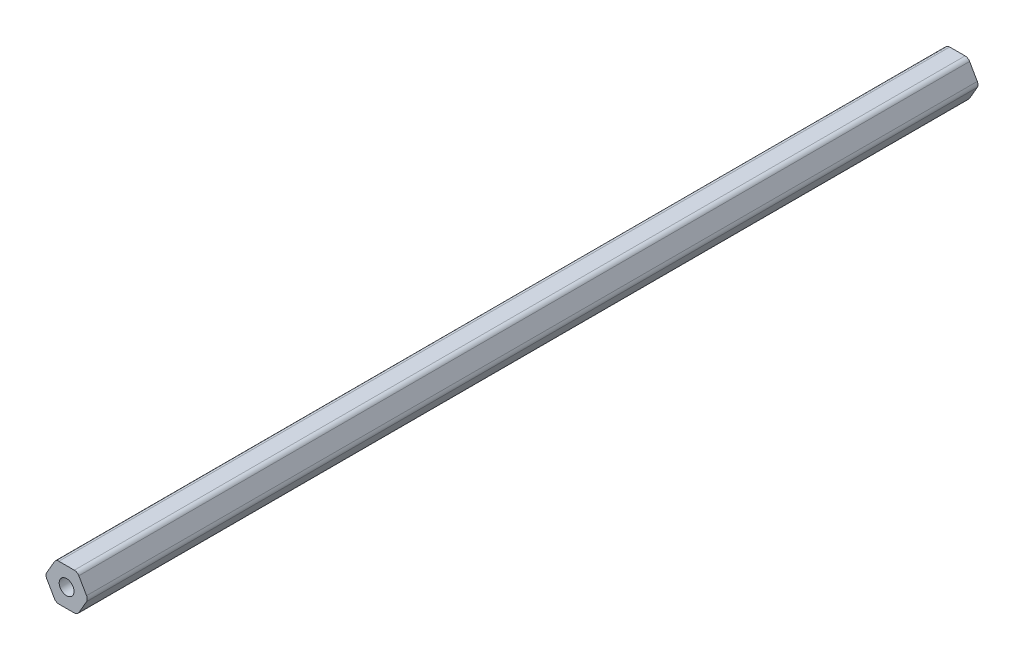
ISO-10303-21;
HEADER;
FILE_DESCRIPTION(('STEP AP214'),'2;1');
FILE_NAME('part.step','',(''),(''),'','','');
FILE_SCHEMA(('AUTOMOTIVE_DESIGN { 1 0 10303 214 1 1 1 1 }'));
ENDSEC;
DATA;
#1=APPLICATION_CONTEXT('core data for automotive mechanical design processes');
#2=APPLICATION_PROTOCOL_DEFINITION('international standard','automotive_design',2000,#1);
#3=PRODUCT_CONTEXT('',#1,'mechanical');
#4=PRODUCT('Part','Part','',(#3));
#5=PRODUCT_RELATED_PRODUCT_CATEGORY('part','',(#4));
#6=PRODUCT_DEFINITION_FORMATION('','',#4);
#7=PRODUCT_DEFINITION_CONTEXT('part definition',#1,'design');
#8=PRODUCT_DEFINITION('design','',#6,#7);
#9=PRODUCT_DEFINITION_SHAPE('','',#8);
#10=(LENGTH_UNIT() NAMED_UNIT(*) SI_UNIT(.MILLI.,.METRE.));
#11=(NAMED_UNIT(*) PLANE_ANGLE_UNIT() SI_UNIT($,.RADIAN.));
#12=(NAMED_UNIT(*) SI_UNIT($,.STERADIAN.) SOLID_ANGLE_UNIT());
#13=UNCERTAINTY_MEASURE_WITH_UNIT(LENGTH_MEASURE(1.E-05),#10,'distance_accuracy_value','');
#14=(GEOMETRIC_REPRESENTATION_CONTEXT(3) GLOBAL_UNCERTAINTY_ASSIGNED_CONTEXT((#13)) GLOBAL_UNIT_ASSIGNED_CONTEXT((#10,
#11,#12)) REPRESENTATION_CONTEXT('',''));
#15=CARTESIAN_POINT('',(0.,0.,0.));
#16=DIRECTION('',(0.,0.,1.));
#17=DIRECTION('',(1.,0.,0.));
#18=AXIS2_PLACEMENT_3D('',#15,#16,#17);
#19=CARTESIAN_POINT('',(0.,0.,304.8));
#20=DIRECTION('',(0.,0.,1.));
#21=DIRECTION('',(1.,0.,0.));
#22=AXIS2_PLACEMENT_3D('',#19,#20,#21);
#23=PLANE('',#22);
#24=DIRECTION('',(-0.499999999999995,-0.866025403784442,0.));
#25=VECTOR('',#24,1.);
#26=CARTESIAN_POINT('',(-4.29020386201017,9.04112787707909,304.8));
#27=LINE('',#26,#25);
#28=CARTESIAN_POINT('',(-4.80346825131974,8.15212787707908,304.8));
#29=VERTEX_POINT('',#28);
#30=CARTESIAN_POINT('',(-7.44311368205469,3.58012787707905,304.8));
#31=VERTEX_POINT('',#30);
#32=EDGE_CURVE('E273',#29,#31,#27,.T.);
#33=ORIENTED_EDGE('',*,*,#32,.T.);
#34=CARTESIAN_POINT('',(-5.90332051412595,2.69112787707906,304.8));
#35=DIRECTION('',(0.,0.,1.));
#36=DIRECTION('',(1.,0.,0.));
#37=AXIS2_PLACEMENT_3D('',#34,#35,#36);
#38=CIRCLE('',#37,1.778);
#39=CARTESIAN_POINT('',(-7.44311368205468,1.80212787707905,304.8));
#40=VERTEX_POINT('',#39);
#41=EDGE_CURVE('E210',#31,#40,#38,.T.);
#42=ORIENTED_EDGE('',*,*,#41,.T.);
#43=DIRECTION('',(0.500000000000007,-0.866025403784434,0.));
#44=VECTOR('',#43,1.);
#45=CARTESIAN_POINT('',(-7.95637807136426,2.69112787707905,304.8));
#46=LINE('',#45,#44);
#47=CARTESIAN_POINT('',(-4.80346825131967,-2.76987212292094,304.8));
#48=VERTEX_POINT('',#47);
#49=EDGE_CURVE('E155',#40,#48,#46,.T.);
#50=ORIENTED_EDGE('',*,*,#49,.T.);
#51=CARTESIAN_POINT('',(-3.26367508339094,-1.88087212292093,304.8));
#52=DIRECTION('',(0.,0.,1.));
#53=DIRECTION('',(1.,0.,0.));
#54=AXIS2_PLACEMENT_3D('',#51,#52,#53);
#55=CIRCLE('',#54,1.778);
#56=CARTESIAN_POINT('',(-3.26367508339092,-3.65887212292093,304.8));
#57=VERTEX_POINT('',#56);
#58=EDGE_CURVE('E66',#48,#57,#55,.T.);
#59=ORIENTED_EDGE('',*,*,#58,.T.);
#60=DIRECTION('',(1.,0.,0.));
#61=VECTOR('',#60,1.);
#62=CARTESIAN_POINT('',(-4.29020386201008,-3.65887212292094,304.8));
#63=LINE('',#62,#61);
#64=CARTESIAN_POINT('',(2.01561577807904,-3.65887212292087,304.8));
#65=VERTEX_POINT('',#64);
#66=EDGE_CURVE('E177',#57,#65,#63,.T.);
#67=ORIENTED_EDGE('',*,*,#66,.T.);
#68=CARTESIAN_POINT('',(2.01561577807902,-1.88087212292087,304.8));
#69=DIRECTION('',(0.,0.,1.));
#70=DIRECTION('',(1.,0.,0.));
#71=AXIS2_PLACEMENT_3D('',#68,#69,#70);
#72=CIRCLE('',#71,1.778);
#73=CARTESIAN_POINT('',(3.55540894600776,-2.76987212292086,304.8));
#74=VERTEX_POINT('',#73);
#75=EDGE_CURVE('E202',#65,#74,#72,.T.);
#76=ORIENTED_EDGE('',*,*,#75,.T.);
#77=DIRECTION('',(0.499999999999995,0.866025403784441,0.));
#78=VECTOR('',#77,1.);
#79=CARTESIAN_POINT('',(3.04214455669819,-3.65887212292086,304.8));
#80=LINE('',#79,#78);
#81=CARTESIAN_POINT('',(6.19505437674267,1.8021278770791,304.8));
#82=VERTEX_POINT('',#81);
#83=EDGE_CURVE('E170',#74,#82,#80,.T.);
#84=ORIENTED_EDGE('',*,*,#83,.T.);
#85=CARTESIAN_POINT('',(4.65526120881393,2.69112787707909,304.8));
#86=DIRECTION('',(0.,0.,1.));
#87=DIRECTION('',(1.,0.,0.));
#88=AXIS2_PLACEMENT_3D('',#85,#86,#87);
#89=CIRCLE('',#88,1.778);
#90=CARTESIAN_POINT('',(6.19505437674266,3.58012787707909,304.8));
#91=VERTEX_POINT('',#90);
#92=EDGE_CURVE('E199',#82,#91,#89,.T.);
#93=ORIENTED_EDGE('',*,*,#92,.T.);
#94=DIRECTION('',(-0.500000000000001,0.866025403784438,0.));
#95=VECTOR('',#94,1.);
#96=CARTESIAN_POINT('',(6.70831876605224,2.6911278770791,304.8));
#97=LINE('',#96,#95);
#98=CARTESIAN_POINT('',(3.55540894600768,8.15212787707911,304.8));
#99=VERTEX_POINT('',#98);
#100=EDGE_CURVE('E239',#91,#99,#97,.T.);
#101=ORIENTED_EDGE('',*,*,#100,.T.);
#102=CARTESIAN_POINT('',(2.01561577807895,7.26312787707911,304.8));
#103=DIRECTION('',(0.,0.,1.));
#104=DIRECTION('',(1.,0.,0.));
#105=AXIS2_PLACEMENT_3D('',#102,#103,#104);
#106=CIRCLE('',#105,1.778);
#107=CARTESIAN_POINT('',(2.01561577807894,9.04112787707911,304.8));
#108=VERTEX_POINT('',#107);
#109=EDGE_CURVE('E196',#99,#108,#106,.T.);
#110=ORIENTED_EDGE('',*,*,#109,.T.);
#111=DIRECTION('',(-1.,0.,0.));
#112=VECTOR('',#111,1.);
#113=CARTESIAN_POINT('',(3.0421445566981,9.04112787707911,304.8));
#114=LINE('',#113,#112);
#115=CARTESIAN_POINT('',(-3.26367508339101,9.04112787707909,304.8));
#116=VERTEX_POINT('',#115);
#117=EDGE_CURVE('E252',#108,#116,#114,.T.);
#118=ORIENTED_EDGE('',*,*,#117,.T.);
#119=CARTESIAN_POINT('',(-3.263675083391,7.26312787707909,304.8));
#120=DIRECTION('',(0.,0.,1.));
#121=DIRECTION('',(1.,0.,0.));
#122=AXIS2_PLACEMENT_3D('',#119,#120,#121);
#123=CIRCLE('',#122,1.778);
#124=EDGE_CURVE('E207',#116,#29,#123,.T.);
#125=ORIENTED_EDGE('',*,*,#124,.T.);
#126=EDGE_LOOP('',(#33,#42,#50,#59,#67,#76,#84,#93,#101,#110,#118,#125));
#127=FACE_BOUND('',#126,.T.);
#128=CARTESIAN_POINT('',(-0.624029652656013,2.6911278770791,304.8));
#129=DIRECTION('',(0.,0.,1.));
#130=DIRECTION('',(1.,0.,0.));
#131=AXIS2_PLACEMENT_3D('',#128,#129,#130);
#132=CIRCLE('',#131,2.54);
#133=CARTESIAN_POINT('',(-3.16402965265601,2.6911278770791,304.8));
#134=VERTEX_POINT('',#133);
#135=EDGE_CURVE('E268',#134,#134,#132,.T.);
#136=ORIENTED_EDGE('',*,*,#135,.F.);
#137=EDGE_LOOP('',(#136));
#138=FACE_BOUND('',#137,.T.);
#139=ADVANCED_FACE('F43',(#127,#138),#23,.T.);
#140=CARTESIAN_POINT('',(0.,0.,0.));
#141=DIRECTION('',(0.,0.,1.));
#142=DIRECTION('',(1.,0.,0.));
#143=AXIS2_PLACEMENT_3D('',#140,#141,#142);
#144=PLANE('',#143);
#145=DIRECTION('',(0.500000000000007,-0.866025403784434,0.));
#146=VECTOR('',#145,1.);
#147=CARTESIAN_POINT('',(-7.95637807136426,2.69112787707905,0.));
#148=LINE('',#147,#146);
#149=CARTESIAN_POINT('',(-7.44311368205468,1.80212787707905,0.));
#150=VERTEX_POINT('',#149);
#151=CARTESIAN_POINT('',(-4.80346825131967,-2.76987212292094,0.));
#152=VERTEX_POINT('',#151);
#153=EDGE_CURVE('E153',#150,#152,#148,.T.);
#154=ORIENTED_EDGE('',*,*,#153,.F.);
#155=CARTESIAN_POINT('',(-5.90332051412595,2.69112787707906,0.));
#156=DIRECTION('',(0.,0.,1.));
#157=DIRECTION('',(1.,0.,0.));
#158=AXIS2_PLACEMENT_3D('',#155,#156,#157);
#159=CIRCLE('',#158,1.778);
#160=CARTESIAN_POINT('',(-7.44311368205469,3.58012787707905,0.));
#161=VERTEX_POINT('',#160);
#162=EDGE_CURVE('E135',#150,#161,#159,.F.);
#163=ORIENTED_EDGE('',*,*,#162,.T.);
#164=DIRECTION('',(-0.499999999999995,-0.866025403784442,0.));
#165=VECTOR('',#164,1.);
#166=CARTESIAN_POINT('',(-4.29020386201017,9.04112787707909,0.));
#167=LINE('',#166,#165);
#168=CARTESIAN_POINT('',(-4.80346825131974,8.15212787707908,0.));
#169=VERTEX_POINT('',#168);
#170=EDGE_CURVE('E166',#169,#161,#167,.T.);
#171=ORIENTED_EDGE('',*,*,#170,.F.);
#172=CARTESIAN_POINT('',(-3.263675083391,7.26312787707909,0.));
#173=DIRECTION('',(0.,0.,1.));
#174=DIRECTION('',(1.,0.,0.));
#175=AXIS2_PLACEMENT_3D('',#172,#173,#174);
#176=CIRCLE('',#175,1.778);
#177=CARTESIAN_POINT('',(-3.26367508339101,9.04112787707909,0.));
#178=VERTEX_POINT('',#177);
#179=EDGE_CURVE('E147',#169,#178,#176,.F.);
#180=ORIENTED_EDGE('',*,*,#179,.T.);
#181=DIRECTION('',(-1.,0.,0.));
#182=VECTOR('',#181,1.);
#183=CARTESIAN_POINT('',(3.0421445566981,9.04112787707911,0.));
#184=LINE('',#183,#182);
#185=CARTESIAN_POINT('',(2.01561577807894,9.04112787707911,0.));
#186=VERTEX_POINT('',#185);
#187=EDGE_CURVE('E172',#186,#178,#184,.T.);
#188=ORIENTED_EDGE('',*,*,#187,.F.);
#189=CARTESIAN_POINT('',(2.01561577807895,7.26312787707911,0.));
#190=DIRECTION('',(0.,0.,1.));
#191=DIRECTION('',(1.,0.,0.));
#192=AXIS2_PLACEMENT_3D('',#189,#190,#191);
#193=CIRCLE('',#192,1.778);
#194=CARTESIAN_POINT('',(3.55540894600768,8.15212787707911,0.));
#195=VERTEX_POINT('',#194);
#196=EDGE_CURVE('E157',#186,#195,#193,.F.);
#197=ORIENTED_EDGE('',*,*,#196,.T.);
#198=DIRECTION('',(-0.500000000000001,0.866025403784438,0.));
#199=VECTOR('',#198,1.);
#200=CARTESIAN_POINT('',(6.70831876605224,2.6911278770791,0.));
#201=LINE('',#200,#199);
#202=CARTESIAN_POINT('',(6.19505437674266,3.58012787707909,0.));
#203=VERTEX_POINT('',#202);
#204=EDGE_CURVE('E242',#203,#195,#201,.T.);
#205=ORIENTED_EDGE('',*,*,#204,.F.);
#206=CARTESIAN_POINT('',(4.65526120881393,2.69112787707909,0.));
#207=DIRECTION('',(0.,0.,1.));
#208=DIRECTION('',(1.,0.,0.));
#209=AXIS2_PLACEMENT_3D('',#206,#207,#208);
#210=CIRCLE('',#209,1.778);
#211=CARTESIAN_POINT('',(6.19505437674267,1.8021278770791,0.));
#212=VERTEX_POINT('',#211);
#213=EDGE_CURVE('E181',#203,#212,#210,.F.);
#214=ORIENTED_EDGE('',*,*,#213,.T.);
#215=DIRECTION('',(0.499999999999995,0.866025403784441,0.));
#216=VECTOR('',#215,1.);
#217=CARTESIAN_POINT('',(3.04214455669819,-3.65887212292086,0.));
#218=LINE('',#217,#216);
#219=CARTESIAN_POINT('',(3.55540894600776,-2.76987212292086,0.));
#220=VERTEX_POINT('',#219);
#221=EDGE_CURVE('E262',#220,#212,#218,.T.);
#222=ORIENTED_EDGE('',*,*,#221,.F.);
#223=CARTESIAN_POINT('',(2.01561577807902,-1.88087212292087,0.));
#224=DIRECTION('',(0.,0.,1.));
#225=DIRECTION('',(1.,0.,0.));
#226=AXIS2_PLACEMENT_3D('',#223,#224,#225);
#227=CIRCLE('',#226,1.778);
#228=CARTESIAN_POINT('',(2.01561577807904,-3.65887212292087,0.));
#229=VERTEX_POINT('',#228);
#230=EDGE_CURVE('E184',#220,#229,#227,.F.);
#231=ORIENTED_EDGE('',*,*,#230,.T.);
#232=DIRECTION('',(1.,0.,0.));
#233=VECTOR('',#232,1.);
#234=CARTESIAN_POINT('',(-4.29020386201008,-3.65887212292094,0.));
#235=LINE('',#234,#233);
#236=CARTESIAN_POINT('',(-3.26367508339092,-3.65887212292093,0.));
#237=VERTEX_POINT('',#236);
#238=EDGE_CURVE('E165',#237,#229,#235,.T.);
#239=ORIENTED_EDGE('',*,*,#238,.F.);
#240=CARTESIAN_POINT('',(-3.26367508339094,-1.88087212292093,0.));
#241=DIRECTION('',(0.,0.,1.));
#242=DIRECTION('',(1.,0.,0.));
#243=AXIS2_PLACEMENT_3D('',#240,#241,#242);
#244=CIRCLE('',#243,1.778);
#245=EDGE_CURVE('E163',#237,#152,#244,.F.);
#246=ORIENTED_EDGE('',*,*,#245,.T.);
#247=EDGE_LOOP('',(#154,#163,#171,#180,#188,#197,#205,#214,#222,#231,#239,#246));
#248=FACE_BOUND('',#247,.T.);
#249=CARTESIAN_POINT('',(-0.624029652656013,2.6911278770791,0.));
#250=DIRECTION('',(0.,0.,1.));
#251=DIRECTION('',(1.,0.,0.));
#252=AXIS2_PLACEMENT_3D('',#249,#250,#251);
#253=CIRCLE('',#252,2.54);
#254=CARTESIAN_POINT('',(-3.16402965265601,2.6911278770791,0.));
#255=VERTEX_POINT('',#254);
#256=EDGE_CURVE('E280',#255,#255,#253,.T.);
#257=ORIENTED_EDGE('',*,*,#256,.T.);
#258=EDGE_LOOP('',(#257));
#259=FACE_BOUND('',#258,.T.);
#260=ADVANCED_FACE('F160',(#248,#259),#144,.F.);
#261=CARTESIAN_POINT('',(3.04214455669819,-3.65887212292086,304.8));
#262=DIRECTION('',(-0.866025403784442,0.499999999999995,0.));
#263=DIRECTION('',(-0.499999999999995,-0.866025403784442,0.));
#264=AXIS2_PLACEMENT_3D('',#261,#262,#263);
#265=PLANE('',#264);
#266=ORIENTED_EDGE('',*,*,#83,.F.);
#267=DIRECTION('',(0.,0.,-1.));
#268=VECTOR('',#267,1.);
#269=CARTESIAN_POINT('',(3.55540894600776,-2.76987212292086,304.8));
#270=LINE('',#269,#268);
#271=EDGE_CURVE('E229',#74,#220,#270,.T.);
#272=ORIENTED_EDGE('',*,*,#271,.T.);
#273=ORIENTED_EDGE('',*,*,#221,.T.);
#274=DIRECTION('',(0.,0.,-1.));
#275=VECTOR('',#274,1.);
#276=CARTESIAN_POINT('',(6.19505437674267,1.8021278770791,304.8));
#277=LINE('',#276,#275);
#278=EDGE_CURVE('E226',#212,#82,#277,.F.);
#279=ORIENTED_EDGE('',*,*,#278,.T.);
#280=EDGE_LOOP('',(#266,#272,#273,#279));
#281=FACE_BOUND('',#280,.T.);
#282=ADVANCED_FACE('F295',(#281),#265,.F.);
#283=CARTESIAN_POINT('',(6.70831876605224,2.6911278770791,304.8));
#284=DIRECTION('',(-0.866025403784438,-0.500000000000001,0.));
#285=DIRECTION('',(0.500000000000001,-0.866025403784438,0.));
#286=AXIS2_PLACEMENT_3D('',#283,#284,#285);
#287=PLANE('',#286);
#288=ORIENTED_EDGE('',*,*,#100,.F.);
#289=DIRECTION('',(0.,0.,-1.));
#290=VECTOR('',#289,1.);
#291=CARTESIAN_POINT('',(6.19505437674266,3.58012787707909,304.8));
#292=LINE('',#291,#290);
#293=EDGE_CURVE('E11',#91,#203,#292,.T.);
#294=ORIENTED_EDGE('',*,*,#293,.T.);
#295=ORIENTED_EDGE('',*,*,#204,.T.);
#296=DIRECTION('',(0.,0.,-1.));
#297=VECTOR('',#296,1.);
#298=CARTESIAN_POINT('',(3.55540894600768,8.15212787707911,304.8));
#299=LINE('',#298,#297);
#300=EDGE_CURVE('E52',#195,#99,#299,.F.);
#301=ORIENTED_EDGE('',*,*,#300,.T.);
#302=EDGE_LOOP('',(#288,#294,#295,#301));
#303=FACE_BOUND('',#302,.T.);
#304=ADVANCED_FACE('F238',(#303),#287,.F.);
#305=CARTESIAN_POINT('',(3.0421445566981,9.04112787707911,304.8));
#306=DIRECTION('',(0.,-1.,0.));
#307=DIRECTION('',(1.,0.,0.));
#308=AXIS2_PLACEMENT_3D('',#305,#306,#307);
#309=PLANE('',#308);
#310=ORIENTED_EDGE('',*,*,#187,.T.);
#311=DIRECTION('',(0.,0.,-1.));
#312=VECTOR('',#311,1.);
#313=CARTESIAN_POINT('',(-3.26367508339101,9.04112787707909,304.8));
#314=LINE('',#313,#312);
#315=EDGE_CURVE('E217',#178,#116,#314,.F.);
#316=ORIENTED_EDGE('',*,*,#315,.T.);
#317=ORIENTED_EDGE('',*,*,#117,.F.);
#318=DIRECTION('',(0.,0.,-1.));
#319=VECTOR('',#318,1.);
#320=CARTESIAN_POINT('',(2.01561577807894,9.04112787707911,304.8));
#321=LINE('',#320,#319);
#322=EDGE_CURVE('E213',#108,#186,#321,.T.);
#323=ORIENTED_EDGE('',*,*,#322,.T.);
#324=EDGE_LOOP('',(#310,#316,#317,#323));
#325=FACE_BOUND('',#324,.T.);
#326=ADVANCED_FACE('F258',(#325),#309,.F.);
#327=CARTESIAN_POINT('',(-4.29020386201017,9.04112787707909,304.8));
#328=DIRECTION('',(0.866025403784442,-0.499999999999995,0.));
#329=DIRECTION('',(0.499999999999995,0.866025403784442,0.));
#330=AXIS2_PLACEMENT_3D('',#327,#328,#329);
#331=PLANE('',#330);
#332=ORIENTED_EDGE('',*,*,#170,.T.);
#333=DIRECTION('',(0.,0.,-1.));
#334=VECTOR('',#333,1.);
#335=CARTESIAN_POINT('',(-7.44311368205469,3.58012787707905,304.8));
#336=LINE('',#335,#334);
#337=EDGE_CURVE('E140',#161,#31,#336,.F.);
#338=ORIENTED_EDGE('',*,*,#337,.T.);
#339=ORIENTED_EDGE('',*,*,#32,.F.);
#340=DIRECTION('',(0.,0.,-1.));
#341=VECTOR('',#340,1.);
#342=CARTESIAN_POINT('',(-4.80346825131974,8.15212787707908,304.8));
#343=LINE('',#342,#341);
#344=EDGE_CURVE('E146',#29,#169,#343,.T.);
#345=ORIENTED_EDGE('',*,*,#344,.T.);
#346=EDGE_LOOP('',(#332,#338,#339,#345));
#347=FACE_BOUND('',#346,.T.);
#348=ADVANCED_FACE('F304',(#347),#331,.F.);
#349=CARTESIAN_POINT('',(-7.95637807136426,2.69112787707905,304.8));
#350=DIRECTION('',(0.866025403784435,0.500000000000007,0.));
#351=DIRECTION('',(-0.500000000000007,0.866025403784435,0.));
#352=AXIS2_PLACEMENT_3D('',#349,#350,#351);
#353=PLANE('',#352);
#354=ORIENTED_EDGE('',*,*,#49,.F.);
#355=DIRECTION('',(0.,0.,-1.));
#356=VECTOR('',#355,1.);
#357=CARTESIAN_POINT('',(-7.44311368205468,1.80212787707905,304.8));
#358=LINE('',#357,#356);
#359=EDGE_CURVE('E139',#40,#150,#358,.T.);
#360=ORIENTED_EDGE('',*,*,#359,.T.);
#361=ORIENTED_EDGE('',*,*,#153,.T.);
#362=DIRECTION('',(0.,0.,-1.));
#363=VECTOR('',#362,1.);
#364=CARTESIAN_POINT('',(-4.80346825131967,-2.76987212292094,304.8));
#365=LINE('',#364,#363);
#366=EDGE_CURVE('E158',#152,#48,#365,.F.);
#367=ORIENTED_EDGE('',*,*,#366,.T.);
#368=EDGE_LOOP('',(#354,#360,#361,#367));
#369=FACE_BOUND('',#368,.T.);
#370=ADVANCED_FACE('F152',(#369),#353,.F.);
#371=CARTESIAN_POINT('',(-4.29020386201008,-3.65887212292094,304.8));
#372=DIRECTION('',(0.,1.,0.));
#373=DIRECTION('',(-1.,0.,0.));
#374=AXIS2_PLACEMENT_3D('',#371,#372,#373);
#375=PLANE('',#374);
#376=ORIENTED_EDGE('',*,*,#66,.F.);
#377=DIRECTION('',(0.,0.,-1.));
#378=VECTOR('',#377,1.);
#379=CARTESIAN_POINT('',(-3.26367508339092,-3.65887212292093,304.8));
#380=LINE('',#379,#378);
#381=EDGE_CURVE('E222',#57,#237,#380,.T.);
#382=ORIENTED_EDGE('',*,*,#381,.T.);
#383=ORIENTED_EDGE('',*,*,#238,.T.);
#384=DIRECTION('',(0.,0.,-1.));
#385=VECTOR('',#384,1.);
#386=CARTESIAN_POINT('',(2.01561577807904,-3.65887212292087,304.8));
#387=LINE('',#386,#385);
#388=EDGE_CURVE('E59',#229,#65,#387,.F.);
#389=ORIENTED_EDGE('',*,*,#388,.T.);
#390=EDGE_LOOP('',(#376,#382,#383,#389));
#391=FACE_BOUND('',#390,.T.);
#392=ADVANCED_FACE('F299',(#391),#375,.F.);
#393=CARTESIAN_POINT('',(-0.624029652656013,2.6911278770791,304.8));
#394=DIRECTION('',(0.,0.,-1.));
#395=DIRECTION('',(-1.,0.,0.));
#396=AXIS2_PLACEMENT_3D('',#393,#394,#395);
#397=CYLINDRICAL_SURFACE('',#396,2.54);
#398=CARTESIAN_POINT('',(-3.16402965265601,2.6911278770791,304.8));
#399=CARTESIAN_POINT('',(-3.16402965265601,2.6911278770791,301.625));
#400=CARTESIAN_POINT('',(-3.16402965265601,2.6911278770791,298.45));
#401=CARTESIAN_POINT('',(-3.16402965265601,2.6911278770791,292.1));
#402=CARTESIAN_POINT('',(-3.16402965265601,2.6911278770791,288.925));
#403=CARTESIAN_POINT('',(-3.16402965265601,2.6911278770791,282.575));
#404=CARTESIAN_POINT('',(-3.16402965265601,2.6911278770791,279.4));
#405=CARTESIAN_POINT('',(-3.16402965265601,2.6911278770791,273.05));
#406=CARTESIAN_POINT('',(-3.16402965265601,2.6911278770791,269.875));
#407=CARTESIAN_POINT('',(-3.16402965265601,2.6911278770791,263.525));
#408=CARTESIAN_POINT('',(-3.16402965265601,2.6911278770791,260.35));
#409=CARTESIAN_POINT('',(-3.16402965265601,2.6911278770791,254.));
#410=CARTESIAN_POINT('',(-3.16402965265601,2.6911278770791,250.825));
#411=CARTESIAN_POINT('',(-3.16402965265601,2.6911278770791,244.475));
#412=CARTESIAN_POINT('',(-3.16402965265601,2.6911278770791,241.3));
#413=CARTESIAN_POINT('',(-3.16402965265601,2.6911278770791,234.95));
#414=CARTESIAN_POINT('',(-3.16402965265601,2.6911278770791,231.775));
#415=CARTESIAN_POINT('',(-3.16402965265601,2.6911278770791,225.425));
#416=CARTESIAN_POINT('',(-3.16402965265601,2.6911278770791,222.25));
#417=CARTESIAN_POINT('',(-3.16402965265601,2.6911278770791,215.9));
#418=CARTESIAN_POINT('',(-3.16402965265601,2.6911278770791,212.725));
#419=CARTESIAN_POINT('',(-3.16402965265601,2.6911278770791,206.375));
#420=CARTESIAN_POINT('',(-3.16402965265601,2.6911278770791,203.2));
#421=CARTESIAN_POINT('',(-3.16402965265601,2.6911278770791,196.85));
#422=CARTESIAN_POINT('',(-3.16402965265601,2.6911278770791,193.675));
#423=CARTESIAN_POINT('',(-3.16402965265601,2.6911278770791,187.325));
#424=CARTESIAN_POINT('',(-3.16402965265601,2.6911278770791,184.15));
#425=CARTESIAN_POINT('',(-3.16402965265601,2.6911278770791,177.8));
#426=CARTESIAN_POINT('',(-3.16402965265601,2.6911278770791,174.625));
#427=CARTESIAN_POINT('',(-3.16402965265601,2.6911278770791,168.275));
#428=CARTESIAN_POINT('',(-3.16402965265601,2.6911278770791,165.1));
#429=CARTESIAN_POINT('',(-3.16402965265601,2.6911278770791,158.75));
#430=CARTESIAN_POINT('',(-3.16402965265601,2.6911278770791,155.575));
#431=CARTESIAN_POINT('',(-3.16402965265601,2.6911278770791,149.225));
#432=CARTESIAN_POINT('',(-3.16402965265601,2.6911278770791,146.05));
#433=CARTESIAN_POINT('',(-3.16402965265601,2.6911278770791,139.7));
#434=CARTESIAN_POINT('',(-3.16402965265601,2.6911278770791,136.525));
#435=CARTESIAN_POINT('',(-3.16402965265601,2.6911278770791,130.175));
#436=CARTESIAN_POINT('',(-3.16402965265601,2.6911278770791,127.));
#437=CARTESIAN_POINT('',(-3.16402965265601,2.6911278770791,120.65));
#438=CARTESIAN_POINT('',(-3.16402965265601,2.6911278770791,117.475));
#439=CARTESIAN_POINT('',(-3.16402965265601,2.6911278770791,111.125));
#440=CARTESIAN_POINT('',(-3.16402965265601,2.6911278770791,107.95));
#441=CARTESIAN_POINT('',(-3.16402965265601,2.6911278770791,101.6));
#442=CARTESIAN_POINT('',(-3.16402965265601,2.6911278770791,98.425));
#443=CARTESIAN_POINT('',(-3.16402965265601,2.6911278770791,92.075));
#444=CARTESIAN_POINT('',(-3.16402965265601,2.6911278770791,88.9));
#445=CARTESIAN_POINT('',(-3.16402965265601,2.6911278770791,82.55));
#446=CARTESIAN_POINT('',(-3.16402965265601,2.6911278770791,79.375));
#447=CARTESIAN_POINT('',(-3.16402965265601,2.6911278770791,73.025));
#448=CARTESIAN_POINT('',(-3.16402965265601,2.6911278770791,69.85));
#449=CARTESIAN_POINT('',(-3.16402965265601,2.6911278770791,63.5));
#450=CARTESIAN_POINT('',(-3.16402965265601,2.6911278770791,60.325));
#451=CARTESIAN_POINT('',(-3.16402965265601,2.6911278770791,53.975));
#452=CARTESIAN_POINT('',(-3.16402965265601,2.6911278770791,50.8));
#453=CARTESIAN_POINT('',(-3.16402965265601,2.6911278770791,44.45));
#454=CARTESIAN_POINT('',(-3.16402965265601,2.6911278770791,41.275));
#455=CARTESIAN_POINT('',(-3.16402965265601,2.6911278770791,34.925));
#456=CARTESIAN_POINT('',(-3.16402965265601,2.6911278770791,31.75));
#457=CARTESIAN_POINT('',(-3.16402965265601,2.6911278770791,25.4));
#458=CARTESIAN_POINT('',(-3.16402965265601,2.6911278770791,22.225));
#459=CARTESIAN_POINT('',(-3.16402965265601,2.6911278770791,15.875));
#460=CARTESIAN_POINT('',(-3.16402965265601,2.6911278770791,12.7));
#461=CARTESIAN_POINT('',(-3.16402965265601,2.6911278770791,6.35));
#462=CARTESIAN_POINT('',(-3.16402965265601,2.6911278770791,3.175));
#463=CARTESIAN_POINT('',(-3.16402965265601,2.6911278770791,0.));
#464=B_SPLINE_CURVE_WITH_KNOTS('',3,(#398,#399,#400,#401,#402,#403,#404,#405,#406,#407,#408,
#409,#410,#411,#412,#413,#414,#415,#416,#417,#418,#419,#420,#421,#422,#423,#424,#425,#426,#427,
#428,#429,#430,#431,#432,#433,#434,#435,#436,#437,#438,#439,#440,#441,#442,#443,#444,#445,#446,
#447,#448,#449,#450,#451,#452,#453,#454,#455,#456,#457,#458,#459,#460,#461,#462,#463),
.UNSPECIFIED.,.F.,.F.,(4,2,2,2,2,2,2,2,2,2,2,2,2,2,2,2,2,2,2,2,2,2,2,2,2,2,2,2,2,2,2,2,4),(0.,
9.52500000000001,19.05,28.575,38.1,47.625,57.15,66.675,76.2,85.7250000000001,95.2500000000001,
104.775,114.3,123.825,133.35,142.875,152.4,161.925,171.45,180.975,190.5,200.025,209.55,219.075,
228.6,238.125,247.65,257.175,266.7,276.225,285.75,295.275,304.8),.UNSPECIFIED.);
#465=EDGE_CURVE('BSEAM288',#134,#255,#464,.T.);
#466=ORIENTED_EDGE('',*,*,#135,.T.);
#467=ORIENTED_EDGE('',*,*,#256,.F.);
#468=ORIENTED_EDGE('',*,*,#465,.T.);
#469=ORIENTED_EDGE('',*,*,#465,.F.);
#470=EDGE_LOOP('',(#466,#468,#467,#469));
#471=FACE_BOUND('',#470,.T.);
#472=ADVANCED_FACE('F288',(#471),#397,.F.);
#473=CARTESIAN_POINT('',(-5.90332051412595,2.69112787707906,304.8));
#474=DIRECTION('',(0.,0.,-1.));
#475=DIRECTION('',(-1.,0.,0.));
#476=AXIS2_PLACEMENT_3D('',#473,#474,#475);
#477=CYLINDRICAL_SURFACE('',#476,1.778);
#478=ORIENTED_EDGE('',*,*,#41,.F.);
#479=ORIENTED_EDGE('',*,*,#337,.F.);
#480=ORIENTED_EDGE('',*,*,#162,.F.);
#481=ORIENTED_EDGE('',*,*,#359,.F.);
#482=EDGE_LOOP('',(#478,#479,#480,#481));
#483=FACE_BOUND('',#482,.T.);
#484=ADVANCED_FACE('F138',(#483),#477,.T.);
#485=CARTESIAN_POINT('',(-3.263675083391,7.26312787707909,304.8));
#486=DIRECTION('',(0.,0.,-1.));
#487=DIRECTION('',(-1.,0.,0.));
#488=AXIS2_PLACEMENT_3D('',#485,#486,#487);
#489=CYLINDRICAL_SURFACE('',#488,1.778);
#490=ORIENTED_EDGE('',*,*,#124,.F.);
#491=ORIENTED_EDGE('',*,*,#315,.F.);
#492=ORIENTED_EDGE('',*,*,#179,.F.);
#493=ORIENTED_EDGE('',*,*,#344,.F.);
#494=EDGE_LOOP('',(#490,#491,#492,#493));
#495=FACE_BOUND('',#494,.T.);
#496=ADVANCED_FACE('F317',(#495),#489,.T.);
#497=CARTESIAN_POINT('',(-3.26367508339094,-1.88087212292093,304.8));
#498=DIRECTION('',(0.,0.,-1.));
#499=DIRECTION('',(-1.,0.,0.));
#500=AXIS2_PLACEMENT_3D('',#497,#498,#499);
#501=CYLINDRICAL_SURFACE('',#500,1.778);
#502=ORIENTED_EDGE('',*,*,#58,.F.);
#503=ORIENTED_EDGE('',*,*,#366,.F.);
#504=ORIENTED_EDGE('',*,*,#245,.F.);
#505=ORIENTED_EDGE('',*,*,#381,.F.);
#506=EDGE_LOOP('',(#502,#503,#504,#505));
#507=FACE_BOUND('',#506,.T.);
#508=ADVANCED_FACE('F320',(#507),#501,.T.);
#509=CARTESIAN_POINT('',(2.01561577807902,-1.88087212292087,304.8));
#510=DIRECTION('',(0.,0.,-1.));
#511=DIRECTION('',(-1.,0.,0.));
#512=AXIS2_PLACEMENT_3D('',#509,#510,#511);
#513=CYLINDRICAL_SURFACE('',#512,1.778);
#514=ORIENTED_EDGE('',*,*,#75,.F.);
#515=ORIENTED_EDGE('',*,*,#388,.F.);
#516=ORIENTED_EDGE('',*,*,#230,.F.);
#517=ORIENTED_EDGE('',*,*,#271,.F.);
#518=EDGE_LOOP('',(#514,#515,#516,#517));
#519=FACE_BOUND('',#518,.T.);
#520=ADVANCED_FACE('F324',(#519),#513,.T.);
#521=CARTESIAN_POINT('',(4.65526120881393,2.69112787707909,304.8));
#522=DIRECTION('',(0.,0.,-1.));
#523=DIRECTION('',(-1.,0.,0.));
#524=AXIS2_PLACEMENT_3D('',#521,#522,#523);
#525=CYLINDRICAL_SURFACE('',#524,1.778);
#526=ORIENTED_EDGE('',*,*,#92,.F.);
#527=ORIENTED_EDGE('',*,*,#278,.F.);
#528=ORIENTED_EDGE('',*,*,#213,.F.);
#529=ORIENTED_EDGE('',*,*,#293,.F.);
#530=EDGE_LOOP('',(#526,#527,#528,#529));
#531=FACE_BOUND('',#530,.T.);
#532=ADVANCED_FACE('F327',(#531),#525,.T.);
#533=CARTESIAN_POINT('',(2.01561577807895,7.26312787707911,304.8));
#534=DIRECTION('',(0.,0.,-1.));
#535=DIRECTION('',(-1.,0.,0.));
#536=AXIS2_PLACEMENT_3D('',#533,#534,#535);
#537=CYLINDRICAL_SURFACE('',#536,1.778);
#538=ORIENTED_EDGE('',*,*,#109,.F.);
#539=ORIENTED_EDGE('',*,*,#300,.F.);
#540=ORIENTED_EDGE('',*,*,#196,.F.);
#541=ORIENTED_EDGE('',*,*,#322,.F.);
#542=EDGE_LOOP('',(#538,#539,#540,#541));
#543=FACE_BOUND('',#542,.T.);
#544=ADVANCED_FACE('F45',(#543),#537,.T.);
#545=CLOSED_SHELL('',(#139,#260,#282,#304,#326,#348,#370,#392,#472,#484,#496,#508,#520,#532,#544));
#546=MANIFOLD_SOLID_BREP('B2',#545);
#547=ADVANCED_BREP_SHAPE_REPRESENTATION('',(#18,#546),#14);
#548=SHAPE_DEFINITION_REPRESENTATION(#9,#547);
ENDSEC;
END-ISO-10303-21;
